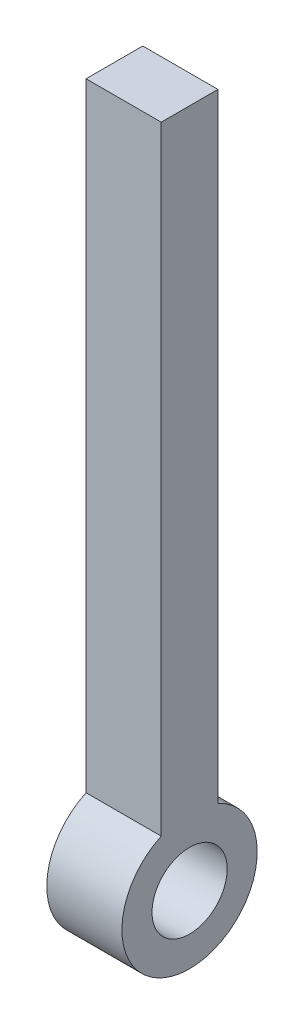
ISO-10303-21;
HEADER;
FILE_DESCRIPTION(('STEP AP214'),'2;1');
FILE_NAME('part.step','',(''),(''),'','','');
FILE_SCHEMA(('AUTOMOTIVE_DESIGN { 1 0 10303 214 1 1 1 1 }'));
ENDSEC;
DATA;
#1=APPLICATION_CONTEXT('core data for automotive mechanical design processes');
#2=APPLICATION_PROTOCOL_DEFINITION('international standard','automotive_design',2000,#1);
#3=PRODUCT_CONTEXT('',#1,'mechanical');
#4=PRODUCT('Part','Part','',(#3));
#5=PRODUCT_RELATED_PRODUCT_CATEGORY('part','',(#4));
#6=PRODUCT_DEFINITION_FORMATION('','',#4);
#7=PRODUCT_DEFINITION_CONTEXT('part definition',#1,'design');
#8=PRODUCT_DEFINITION('design','',#6,#7);
#9=PRODUCT_DEFINITION_SHAPE('','',#8);
#10=(LENGTH_UNIT() NAMED_UNIT(*) SI_UNIT(.MILLI.,.METRE.));
#11=(NAMED_UNIT(*) PLANE_ANGLE_UNIT() SI_UNIT($,.RADIAN.));
#12=(NAMED_UNIT(*) SI_UNIT($,.STERADIAN.) SOLID_ANGLE_UNIT());
#13=UNCERTAINTY_MEASURE_WITH_UNIT(LENGTH_MEASURE(1.E-05),#10,'distance_accuracy_value','');
#14=(GEOMETRIC_REPRESENTATION_CONTEXT(3) GLOBAL_UNCERTAINTY_ASSIGNED_CONTEXT((#13)) GLOBAL_UNIT_ASSIGNED_CONTEXT((#10,
#11,#12)) REPRESENTATION_CONTEXT('',''));
#15=CARTESIAN_POINT('',(0.,0.,0.));
#16=DIRECTION('',(0.,0.,1.));
#17=DIRECTION('',(1.,0.,0.));
#18=AXIS2_PLACEMENT_3D('',#15,#16,#17);
#19=CARTESIAN_POINT('',(50.,0.,18.8664540177232));
#20=DIRECTION('',(0.,0.,1.));
#21=DIRECTION('',(1.,0.,0.));
#22=AXIS2_PLACEMENT_3D('',#19,#20,#21);
#23=PLANE('',#22);
#24=DIRECTION('',(0.,1.,0.));
#25=VECTOR('',#24,1.);
#26=CARTESIAN_POINT('',(0.,0.,18.8664540177232));
#27=LINE('',#26,#25);
#28=CARTESIAN_POINT('',(0.,40.8540929748432,18.8664540177232));
#29=VERTEX_POINT('',#28);
#30=CARTESIAN_POINT('',(0.,452.179666397855,18.8664540177232));
#31=VERTEX_POINT('',#30);
#32=EDGE_CURVE('E114',#29,#31,#27,.T.);
#33=ORIENTED_EDGE('',*,*,#32,.F.);
#34=DIRECTION('',(-1.,0.,0.));
#35=VECTOR('',#34,1.);
#36=CARTESIAN_POINT('',(50.,40.8540929748432,18.8664540177232));
#37=LINE('',#36,#35);
#38=CARTESIAN_POINT('',(50.,40.8540929748432,18.8664540177232));
#39=VERTEX_POINT('',#38);
#40=EDGE_CURVE('E11',#39,#29,#37,.T.);
#41=ORIENTED_EDGE('',*,*,#40,.F.);
#42=DIRECTION('',(0.,1.,0.));
#43=VECTOR('',#42,1.);
#44=CARTESIAN_POINT('',(50.,0.,18.8664540177232));
#45=LINE('',#44,#43);
#46=CARTESIAN_POINT('',(50.,452.179666397855,18.8664540177232));
#47=VERTEX_POINT('',#46);
#48=EDGE_CURVE('E98',#39,#47,#45,.T.);
#49=ORIENTED_EDGE('',*,*,#48,.T.);
#50=DIRECTION('',(-1.,0.,0.));
#51=VECTOR('',#50,1.);
#52=CARTESIAN_POINT('',(50.,452.179666397855,18.8664540177232));
#53=LINE('',#52,#51);
#54=EDGE_CURVE('E60',#47,#31,#53,.T.);
#55=ORIENTED_EDGE('',*,*,#54,.T.);
#56=EDGE_LOOP('',(#33,#41,#49,#55));
#57=FACE_BOUND('',#56,.T.);
#58=ADVANCED_FACE('F43',(#57),#23,.T.);
#59=CARTESIAN_POINT('',(50.,0.,0.));
#60=DIRECTION('',(-1.,0.,0.));
#61=DIRECTION('',(0.,0.,1.));
#62=AXIS2_PLACEMENT_3D('',#59,#60,#61);
#63=CYLINDRICAL_SURFACE('',#62,45.);
#64=CARTESIAN_POINT('',(0.,0.,0.));
#65=DIRECTION('',(1.,0.,0.));
#66=DIRECTION('',(0.,0.,-1.));
#67=AXIS2_PLACEMENT_3D('',#64,#65,#66);
#68=CIRCLE('',#67,45.);
#69=CARTESIAN_POINT('',(0.,40.8540929748432,-18.8664540177232));
#70=VERTEX_POINT('',#69);
#71=EDGE_CURVE('E103',#29,#70,#68,.T.);
#72=ORIENTED_EDGE('',*,*,#71,.T.);
#73=DIRECTION('',(-1.,0.,0.));
#74=VECTOR('',#73,1.);
#75=CARTESIAN_POINT('',(50.,40.8540929748432,-18.8664540177232));
#76=LINE('',#75,#74);
#77=CARTESIAN_POINT('',(50.,40.8540929748432,-18.8664540177232));
#78=VERTEX_POINT('',#77);
#79=EDGE_CURVE('E52',#78,#70,#76,.T.);
#80=ORIENTED_EDGE('',*,*,#79,.F.);
#81=CARTESIAN_POINT('',(50.,0.,0.));
#82=DIRECTION('',(1.,0.,0.));
#83=DIRECTION('',(0.,0.,-1.));
#84=AXIS2_PLACEMENT_3D('',#81,#82,#83);
#85=CIRCLE('',#84,45.);
#86=EDGE_CURVE('E94',#39,#78,#85,.T.);
#87=ORIENTED_EDGE('',*,*,#86,.F.);
#88=ORIENTED_EDGE('',*,*,#40,.T.);
#89=EDGE_LOOP('',(#72,#80,#87,#88));
#90=FACE_BOUND('',#89,.T.);
#91=ADVANCED_FACE('F101',(#90),#63,.T.);
#92=CARTESIAN_POINT('',(50.,0.,-18.8664540177232));
#93=DIRECTION('',(0.,0.,1.));
#94=DIRECTION('',(1.,0.,0.));
#95=AXIS2_PLACEMENT_3D('',#92,#93,#94);
#96=PLANE('',#95);
#97=DIRECTION('',(0.,1.,0.));
#98=VECTOR('',#97,1.);
#99=CARTESIAN_POINT('',(0.,0.,-18.8664540177232));
#100=LINE('',#99,#98);
#101=CARTESIAN_POINT('',(0.,452.179666397855,-18.8664540177232));
#102=VERTEX_POINT('',#101);
#103=EDGE_CURVE('E111',#70,#102,#100,.T.);
#104=ORIENTED_EDGE('',*,*,#103,.T.);
#105=DIRECTION('',(-1.,0.,0.));
#106=VECTOR('',#105,1.);
#107=CARTESIAN_POINT('',(50.,452.179666397855,-18.8664540177232));
#108=LINE('',#107,#106);
#109=CARTESIAN_POINT('',(50.,452.179666397855,-18.8664540177232));
#110=VERTEX_POINT('',#109);
#111=EDGE_CURVE('E74',#110,#102,#108,.T.);
#112=ORIENTED_EDGE('',*,*,#111,.F.);
#113=DIRECTION('',(0.,1.,0.));
#114=VECTOR('',#113,1.);
#115=CARTESIAN_POINT('',(50.,0.,-18.8664540177232));
#116=LINE('',#115,#114);
#117=EDGE_CURVE('E86',#78,#110,#116,.T.);
#118=ORIENTED_EDGE('',*,*,#117,.F.);
#119=ORIENTED_EDGE('',*,*,#79,.T.);
#120=EDGE_LOOP('',(#104,#112,#118,#119));
#121=FACE_BOUND('',#120,.T.);
#122=ADVANCED_FACE('F88',(#121),#96,.F.);
#123=CARTESIAN_POINT('',(50.,0.,0.));
#124=DIRECTION('',(-1.,0.,0.));
#125=DIRECTION('',(0.,0.,1.));
#126=AXIS2_PLACEMENT_3D('',#123,#124,#125);
#127=CYLINDRICAL_SURFACE('',#126,25.);
#128=CARTESIAN_POINT('',(50.,0.,0.));
#129=DIRECTION('',(1.,0.,0.));
#130=DIRECTION('',(0.,0.,-1.));
#131=AXIS2_PLACEMENT_3D('',#128,#129,#130);
#132=CIRCLE('',#131,25.);
#133=CARTESIAN_POINT('',(50.,0.,-25.));
#134=VERTEX_POINT('',#133);
#135=EDGE_CURVE('E110',#134,#134,#132,.T.);
#136=ORIENTED_EDGE('',*,*,#135,.T.);
#137=EDGE_LOOP('',(#136));
#138=FACE_BOUND('',#137,.T.);
#139=CARTESIAN_POINT('',(0.,0.,0.));
#140=DIRECTION('',(1.,0.,0.));
#141=DIRECTION('',(0.,0.,-1.));
#142=AXIS2_PLACEMENT_3D('',#139,#140,#141);
#143=CIRCLE('',#142,25.);
#144=CARTESIAN_POINT('',(0.,0.,-25.));
#145=VERTEX_POINT('',#144);
#146=EDGE_CURVE('E116',#145,#145,#143,.T.);
#147=ORIENTED_EDGE('',*,*,#146,.F.);
#148=EDGE_LOOP('',(#147));
#149=FACE_BOUND('',#148,.T.);
#150=ADVANCED_FACE('F45',(#138,#149),#127,.F.);
#151=CARTESIAN_POINT('',(50.,452.179666397855,0.));
#152=DIRECTION('',(0.,1.,0.));
#153=DIRECTION('',(0.,0.,1.));
#154=AXIS2_PLACEMENT_3D('',#151,#152,#153);
#155=PLANE('',#154);
#156=DIRECTION('',(0.,0.,-1.));
#157=VECTOR('',#156,1.);
#158=CARTESIAN_POINT('',(0.,452.179666397855,0.));
#159=LINE('',#158,#157);
#160=EDGE_CURVE('E107',#31,#102,#159,.T.);
#161=ORIENTED_EDGE('',*,*,#160,.F.);
#162=ORIENTED_EDGE('',*,*,#54,.F.);
#163=DIRECTION('',(0.,0.,-1.));
#164=VECTOR('',#163,1.);
#165=CARTESIAN_POINT('',(50.,452.179666397855,0.));
#166=LINE('',#165,#164);
#167=EDGE_CURVE('E93',#47,#110,#166,.T.);
#168=ORIENTED_EDGE('',*,*,#167,.T.);
#169=ORIENTED_EDGE('',*,*,#111,.T.);
#170=EDGE_LOOP('',(#161,#162,#168,#169));
#171=FACE_BOUND('',#170,.T.);
#172=ADVANCED_FACE('F128',(#171),#155,.T.);
#173=CARTESIAN_POINT('',(50.,0.,0.));
#174=DIRECTION('',(1.,0.,0.));
#175=DIRECTION('',(0.,0.,-1.));
#176=AXIS2_PLACEMENT_3D('',#173,#174,#175);
#177=PLANE('',#176);
#178=ORIENTED_EDGE('',*,*,#135,.F.);
#179=EDGE_LOOP('',(#178));
#180=FACE_BOUND('',#179,.T.);
#181=ORIENTED_EDGE('',*,*,#48,.F.);
#182=ORIENTED_EDGE('',*,*,#86,.T.);
#183=ORIENTED_EDGE('',*,*,#117,.T.);
#184=ORIENTED_EDGE('',*,*,#167,.F.);
#185=EDGE_LOOP('',(#181,#182,#183,#184));
#186=FACE_BOUND('',#185,.T.);
#187=ADVANCED_FACE('F97',(#180,#186),#177,.T.);
#188=CARTESIAN_POINT('',(0.,0.,0.));
#189=DIRECTION('',(1.,0.,0.));
#190=DIRECTION('',(0.,0.,-1.));
#191=AXIS2_PLACEMENT_3D('',#188,#189,#190);
#192=PLANE('',#191);
#193=ORIENTED_EDGE('',*,*,#146,.T.);
#194=EDGE_LOOP('',(#193));
#195=FACE_BOUND('',#194,.T.);
#196=ORIENTED_EDGE('',*,*,#32,.T.);
#197=ORIENTED_EDGE('',*,*,#160,.T.);
#198=ORIENTED_EDGE('',*,*,#103,.F.);
#199=ORIENTED_EDGE('',*,*,#71,.F.);
#200=EDGE_LOOP('',(#196,#197,#198,#199));
#201=FACE_BOUND('',#200,.T.);
#202=ADVANCED_FACE('F127',(#195,#201),#192,.F.);
#203=CLOSED_SHELL('',(#58,#91,#122,#150,#172,#187,#202));
#204=MANIFOLD_SOLID_BREP('B2',#203);
#205=ADVANCED_BREP_SHAPE_REPRESENTATION('',(#18,#204),#14);
#206=SHAPE_DEFINITION_REPRESENTATION(#9,#205);
ENDSEC;
END-ISO-10303-21;
